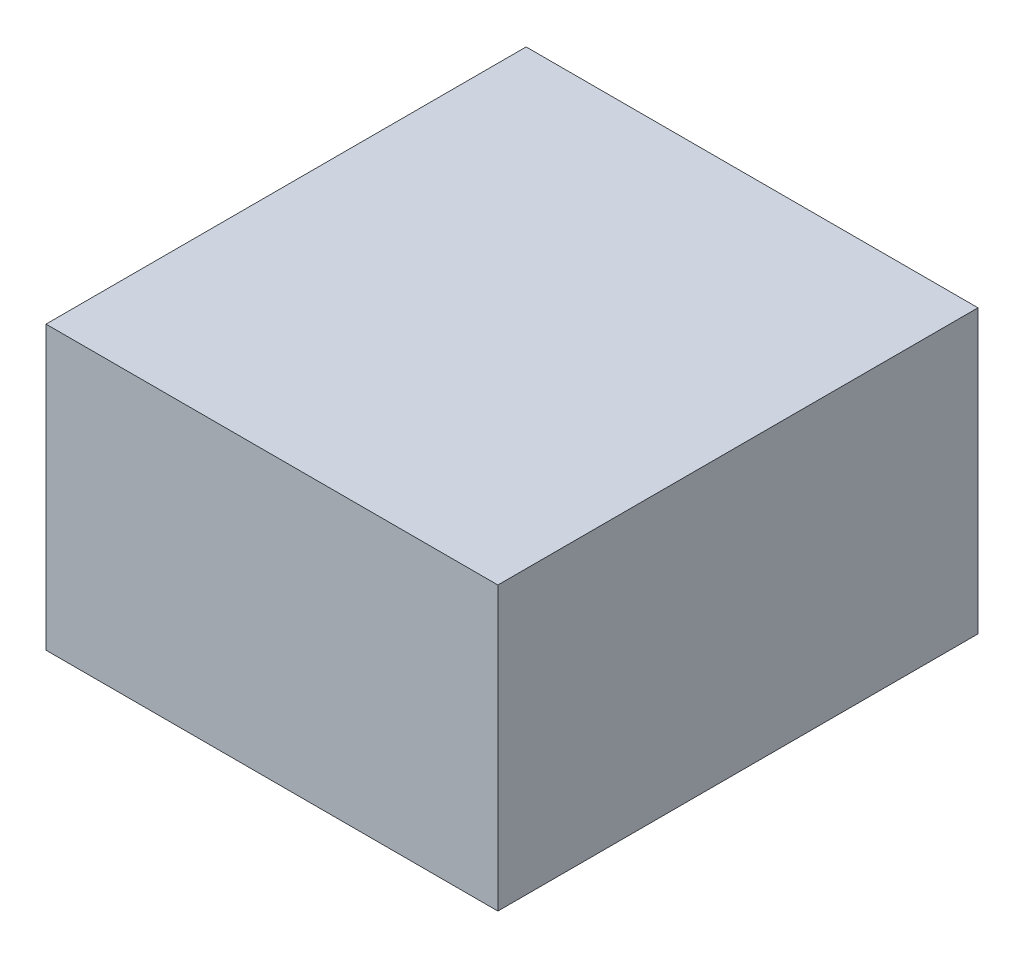
ISO-10303-21;
HEADER;
FILE_DESCRIPTION(('STEP AP214'),'2;1');
FILE_NAME('part.step','',(''),(''),'','','');
FILE_SCHEMA(('AUTOMOTIVE_DESIGN { 1 0 10303 214 1 1 1 1 }'));
ENDSEC;
DATA;
#1=APPLICATION_CONTEXT('core data for automotive mechanical design processes');
#2=APPLICATION_PROTOCOL_DEFINITION('international standard','automotive_design',2000,#1);
#3=PRODUCT_CONTEXT('',#1,'mechanical');
#4=PRODUCT('Part','Part','',(#3));
#5=PRODUCT_RELATED_PRODUCT_CATEGORY('part','',(#4));
#6=PRODUCT_DEFINITION_FORMATION('','',#4);
#7=PRODUCT_DEFINITION_CONTEXT('part definition',#1,'design');
#8=PRODUCT_DEFINITION('design','',#6,#7);
#9=PRODUCT_DEFINITION_SHAPE('','',#8);
#10=(LENGTH_UNIT() NAMED_UNIT(*) SI_UNIT(.MILLI.,.METRE.));
#11=(NAMED_UNIT(*) PLANE_ANGLE_UNIT() SI_UNIT($,.RADIAN.));
#12=(NAMED_UNIT(*) SI_UNIT($,.STERADIAN.) SOLID_ANGLE_UNIT());
#13=UNCERTAINTY_MEASURE_WITH_UNIT(LENGTH_MEASURE(1.E-05),#10,'distance_accuracy_value','');
#14=(GEOMETRIC_REPRESENTATION_CONTEXT(3) GLOBAL_UNCERTAINTY_ASSIGNED_CONTEXT((#13)) GLOBAL_UNIT_ASSIGNED_CONTEXT((#10,
#11,#12)) REPRESENTATION_CONTEXT('',''));
#15=CARTESIAN_POINT('',(0.,0.,0.));
#16=DIRECTION('',(0.,0.,1.));
#17=DIRECTION('',(1.,0.,0.));
#18=AXIS2_PLACEMENT_3D('',#15,#16,#17);
#19=CARTESIAN_POINT('',(0.,10.,0.));
#20=DIRECTION('',(-1.,0.,0.));
#21=DIRECTION('',(0.,0.,1.));
#22=AXIS2_PLACEMENT_3D('',#19,#20,#21);
#23=PLANE('',#22);
#24=DIRECTION('',(0.,0.,-1.));
#25=VECTOR('',#24,1.);
#26=CARTESIAN_POINT('',(0.,0.,0.));
#27=LINE('',#26,#25);
#28=CARTESIAN_POINT('',(0.,0.,17.));
#29=VERTEX_POINT('',#28);
#30=CARTESIAN_POINT('',(0.,0.,0.));
#31=VERTEX_POINT('',#30);
#32=EDGE_CURVE('E102',#29,#31,#27,.T.);
#33=ORIENTED_EDGE('',*,*,#32,.T.);
#34=DIRECTION('',(0.,-1.,0.));
#35=VECTOR('',#34,1.);
#36=CARTESIAN_POINT('',(0.,10.,0.));
#37=LINE('',#36,#35);
#38=CARTESIAN_POINT('',(0.,10.,0.));
#39=VERTEX_POINT('',#38);
#40=EDGE_CURVE('E11',#39,#31,#37,.T.);
#41=ORIENTED_EDGE('',*,*,#40,.F.);
#42=DIRECTION('',(0.,0.,-1.));
#43=VECTOR('',#42,1.);
#44=CARTESIAN_POINT('',(0.,10.,0.));
#45=LINE('',#44,#43);
#46=CARTESIAN_POINT('',(0.,10.,17.));
#47=VERTEX_POINT('',#46);
#48=EDGE_CURVE('E90',#47,#39,#45,.T.);
#49=ORIENTED_EDGE('',*,*,#48,.F.);
#50=DIRECTION('',(0.,-1.,0.));
#51=VECTOR('',#50,1.);
#52=CARTESIAN_POINT('',(0.,10.,17.));
#53=LINE('',#52,#51);
#54=EDGE_CURVE('E98',#47,#29,#53,.T.);
#55=ORIENTED_EDGE('',*,*,#54,.T.);
#56=EDGE_LOOP('',(#33,#41,#49,#55));
#57=FACE_BOUND('',#56,.T.);
#58=ADVANCED_FACE('F39',(#57),#23,.F.);
#59=CARTESIAN_POINT('',(0.,10.,0.));
#60=DIRECTION('',(0.,0.,1.));
#61=DIRECTION('',(1.,0.,0.));
#62=AXIS2_PLACEMENT_3D('',#59,#60,#61);
#63=PLANE('',#62);
#64=DIRECTION('',(-1.,0.,0.));
#65=VECTOR('',#64,1.);
#66=CARTESIAN_POINT('',(0.,0.,0.));
#67=LINE('',#66,#65);
#68=CARTESIAN_POINT('',(-16.,0.,0.));
#69=VERTEX_POINT('',#68);
#70=EDGE_CURVE('E94',#31,#69,#67,.T.);
#71=ORIENTED_EDGE('',*,*,#70,.T.);
#72=DIRECTION('',(0.,-1.,0.));
#73=VECTOR('',#72,1.);
#74=CARTESIAN_POINT('',(-16.,10.,0.));
#75=LINE('',#74,#73);
#76=CARTESIAN_POINT('',(-16.,10.,0.));
#77=VERTEX_POINT('',#76);
#78=EDGE_CURVE('E47',#77,#69,#75,.T.);
#79=ORIENTED_EDGE('',*,*,#78,.F.);
#80=DIRECTION('',(-1.,0.,0.));
#81=VECTOR('',#80,1.);
#82=CARTESIAN_POINT('',(0.,10.,0.));
#83=LINE('',#82,#81);
#84=EDGE_CURVE('E85',#39,#77,#83,.T.);
#85=ORIENTED_EDGE('',*,*,#84,.F.);
#86=ORIENTED_EDGE('',*,*,#40,.T.);
#87=EDGE_LOOP('',(#71,#79,#85,#86));
#88=FACE_BOUND('',#87,.T.);
#89=ADVANCED_FACE('F93',(#88),#63,.F.);
#90=CARTESIAN_POINT('',(-16.,10.,0.));
#91=DIRECTION('',(1.,0.,0.));
#92=DIRECTION('',(0.,0.,-1.));
#93=AXIS2_PLACEMENT_3D('',#90,#91,#92);
#94=PLANE('',#93);
#95=DIRECTION('',(0.,0.,1.));
#96=VECTOR('',#95,1.);
#97=CARTESIAN_POINT('',(-16.,0.,0.));
#98=LINE('',#97,#96);
#99=CARTESIAN_POINT('',(-16.,0.,17.));
#100=VERTEX_POINT('',#99);
#101=EDGE_CURVE('E72',#69,#100,#98,.T.);
#102=ORIENTED_EDGE('',*,*,#101,.T.);
#103=DIRECTION('',(0.,-1.,0.));
#104=VECTOR('',#103,1.);
#105=CARTESIAN_POINT('',(-16.,10.,17.));
#106=LINE('',#105,#104);
#107=CARTESIAN_POINT('',(-16.,10.,17.));
#108=VERTEX_POINT('',#107);
#109=EDGE_CURVE('E95',#108,#100,#106,.T.);
#110=ORIENTED_EDGE('',*,*,#109,.F.);
#111=DIRECTION('',(0.,0.,1.));
#112=VECTOR('',#111,1.);
#113=CARTESIAN_POINT('',(-16.,10.,0.));
#114=LINE('',#113,#112);
#115=EDGE_CURVE('E88',#77,#108,#114,.T.);
#116=ORIENTED_EDGE('',*,*,#115,.F.);
#117=ORIENTED_EDGE('',*,*,#78,.T.);
#118=EDGE_LOOP('',(#102,#110,#116,#117));
#119=FACE_BOUND('',#118,.T.);
#120=ADVANCED_FACE('F96',(#119),#94,.F.);
#121=CARTESIAN_POINT('',(0.,10.,17.));
#122=DIRECTION('',(0.,0.,-1.));
#123=DIRECTION('',(-1.,0.,0.));
#124=AXIS2_PLACEMENT_3D('',#121,#122,#123);
#125=PLANE('',#124);
#126=DIRECTION('',(1.,0.,0.));
#127=VECTOR('',#126,1.);
#128=CARTESIAN_POINT('',(0.,0.,17.));
#129=LINE('',#128,#127);
#130=EDGE_CURVE('E78',#100,#29,#129,.T.);
#131=ORIENTED_EDGE('',*,*,#130,.T.);
#132=ORIENTED_EDGE('',*,*,#54,.F.);
#133=DIRECTION('',(1.,0.,0.));
#134=VECTOR('',#133,1.);
#135=CARTESIAN_POINT('',(0.,10.,17.));
#136=LINE('',#135,#134);
#137=EDGE_CURVE('E55',#108,#47,#136,.T.);
#138=ORIENTED_EDGE('',*,*,#137,.F.);
#139=ORIENTED_EDGE('',*,*,#109,.T.);
#140=EDGE_LOOP('',(#131,#132,#138,#139));
#141=FACE_BOUND('',#140,.T.);
#142=ADVANCED_FACE('F109',(#141),#125,.F.);
#143=CARTESIAN_POINT('',(0.,10.,0.));
#144=DIRECTION('',(0.,-1.,0.));
#145=DIRECTION('',(0.,0.,-1.));
#146=AXIS2_PLACEMENT_3D('',#143,#144,#145);
#147=PLANE('',#146);
#148=ORIENTED_EDGE('',*,*,#48,.T.);
#149=ORIENTED_EDGE('',*,*,#84,.T.);
#150=ORIENTED_EDGE('',*,*,#115,.T.);
#151=ORIENTED_EDGE('',*,*,#137,.T.);
#152=EDGE_LOOP('',(#148,#149,#150,#151));
#153=FACE_BOUND('',#152,.T.);
#154=ADVANCED_FACE('F86',(#153),#147,.F.);
#155=CARTESIAN_POINT('',(0.,0.,0.));
#156=DIRECTION('',(0.,-1.,0.));
#157=DIRECTION('',(0.,0.,-1.));
#158=AXIS2_PLACEMENT_3D('',#155,#156,#157);
#159=PLANE('',#158);
#160=ORIENTED_EDGE('',*,*,#32,.F.);
#161=ORIENTED_EDGE('',*,*,#130,.F.);
#162=ORIENTED_EDGE('',*,*,#101,.F.);
#163=ORIENTED_EDGE('',*,*,#70,.F.);
#164=EDGE_LOOP('',(#160,#161,#162,#163));
#165=FACE_BOUND('',#164,.T.);
#166=ADVANCED_FACE('F112',(#165),#159,.T.);
#167=CLOSED_SHELL('',(#58,#89,#120,#142,#154,#166));
#168=MANIFOLD_SOLID_BREP('B2',#167);
#169=ADVANCED_BREP_SHAPE_REPRESENTATION('',(#18,#168),#14);
#170=SHAPE_DEFINITION_REPRESENTATION(#9,#169);
ENDSEC;
END-ISO-10303-21;
